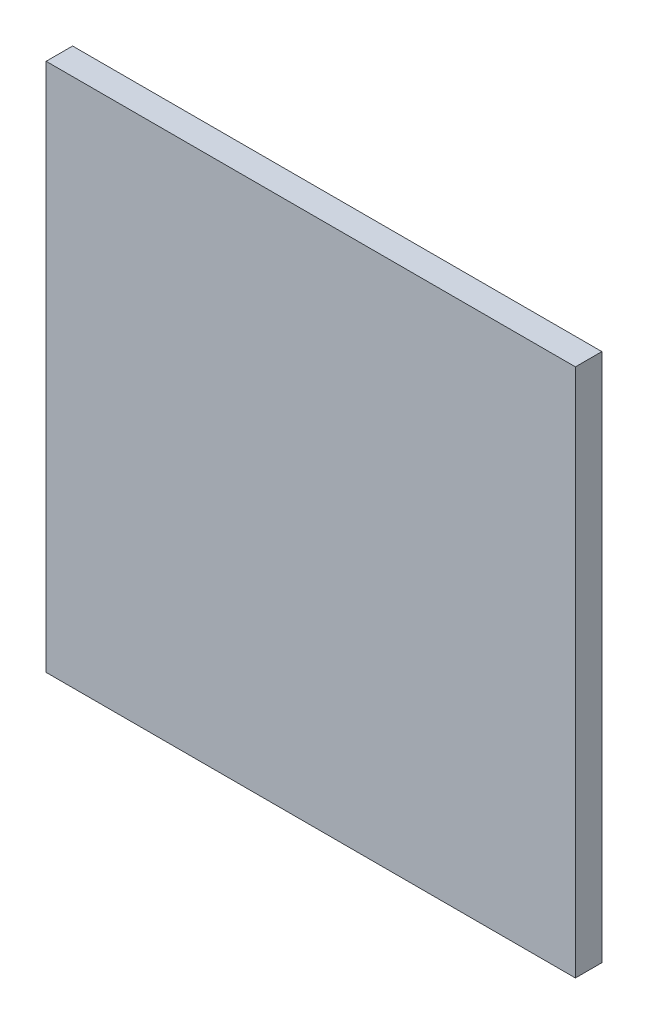
ISO-10303-21;
HEADER;
FILE_DESCRIPTION(('STEP AP214'),'2;1');
FILE_NAME('part.step','',(''),(''),'','','');
FILE_SCHEMA(('AUTOMOTIVE_DESIGN { 1 0 10303 214 1 1 1 1 }'));
ENDSEC;
DATA;
#1=APPLICATION_CONTEXT('core data for automotive mechanical design processes');
#2=APPLICATION_PROTOCOL_DEFINITION('international standard','automotive_design',2000,#1);
#3=PRODUCT_CONTEXT('',#1,'mechanical');
#4=PRODUCT('Part','Part','',(#3));
#5=PRODUCT_RELATED_PRODUCT_CATEGORY('part','',(#4));
#6=PRODUCT_DEFINITION_FORMATION('','',#4);
#7=PRODUCT_DEFINITION_CONTEXT('part definition',#1,'design');
#8=PRODUCT_DEFINITION('design','',#6,#7);
#9=PRODUCT_DEFINITION_SHAPE('','',#8);
#10=(LENGTH_UNIT() NAMED_UNIT(*) SI_UNIT(.MILLI.,.METRE.));
#11=(NAMED_UNIT(*) PLANE_ANGLE_UNIT() SI_UNIT($,.RADIAN.));
#12=(NAMED_UNIT(*) SI_UNIT($,.STERADIAN.) SOLID_ANGLE_UNIT());
#13=UNCERTAINTY_MEASURE_WITH_UNIT(LENGTH_MEASURE(1.E-05),#10,'distance_accuracy_value','');
#14=(GEOMETRIC_REPRESENTATION_CONTEXT(3) GLOBAL_UNCERTAINTY_ASSIGNED_CONTEXT((#13)) GLOBAL_UNIT_ASSIGNED_CONTEXT((#10,
#11,#12)) REPRESENTATION_CONTEXT('',''));
#15=CARTESIAN_POINT('',(0.,0.,0.));
#16=DIRECTION('',(0.,0.,1.));
#17=DIRECTION('',(1.,0.,0.));
#18=AXIS2_PLACEMENT_3D('',#15,#16,#17);
#19=CARTESIAN_POINT('',(0.,0.,0.));
#20=DIRECTION('',(0.,0.,1.));
#21=DIRECTION('',(1.,0.,0.));
#22=AXIS2_PLACEMENT_3D('',#19,#20,#21);
#23=PLANE('',#22);
#24=DIRECTION('',(1.,0.,0.));
#25=VECTOR('',#24,1.);
#26=CARTESIAN_POINT('',(7.,-7.,0.));
#27=LINE('',#26,#25);
#28=CARTESIAN_POINT('',(-7.,-7.,0.));
#29=VERTEX_POINT('',#28);
#30=CARTESIAN_POINT('',(7.,-7.,0.));
#31=VERTEX_POINT('',#30);
#32=EDGE_CURVE('E56',#29,#31,#27,.T.);
#33=ORIENTED_EDGE('',*,*,#32,.F.);
#34=DIRECTION('',(0.,1.,0.));
#35=VECTOR('',#34,1.);
#36=CARTESIAN_POINT('',(-7.,-7.,0.));
#37=LINE('',#36,#35);
#38=CARTESIAN_POINT('',(-7.,7.,0.));
#39=VERTEX_POINT('',#38);
#40=EDGE_CURVE('E19',#39,#29,#37,.F.);
#41=ORIENTED_EDGE('',*,*,#40,.F.);
#42=DIRECTION('',(1.,0.,0.));
#43=VECTOR('',#42,1.);
#44=CARTESIAN_POINT('',(-7.,7.,0.));
#45=LINE('',#44,#43);
#46=CARTESIAN_POINT('',(7.,7.,0.));
#47=VERTEX_POINT('',#46);
#48=EDGE_CURVE('E78',#47,#39,#45,.F.);
#49=ORIENTED_EDGE('',*,*,#48,.F.);
#50=DIRECTION('',(0.,1.,0.));
#51=VECTOR('',#50,1.);
#52=CARTESIAN_POINT('',(7.,7.,0.));
#53=LINE('',#52,#51);
#54=EDGE_CURVE('E54',#31,#47,#53,.T.);
#55=ORIENTED_EDGE('',*,*,#54,.F.);
#56=EDGE_LOOP('',(#33,#41,#49,#55));
#57=FACE_BOUND('',#56,.T.);
#58=ADVANCED_FACE('F16',(#57),#23,.F.);
#59=CARTESIAN_POINT('',(-7.,-7.,0.));
#60=DIRECTION('',(-1.,0.,0.));
#61=DIRECTION('',(0.,0.,1.));
#62=AXIS2_PLACEMENT_3D('',#59,#60,#61);
#63=PLANE('',#62);
#64=DIRECTION('',(0.,1.,0.));
#65=VECTOR('',#64,1.);
#66=CARTESIAN_POINT('',(-7.,0.,0.7));
#67=LINE('',#66,#65);
#68=CARTESIAN_POINT('',(-7.,7.,0.7));
#69=VERTEX_POINT('',#68);
#70=CARTESIAN_POINT('',(-7.,-7.,0.7));
#71=VERTEX_POINT('',#70);
#72=EDGE_CURVE('E82',#69,#71,#67,.F.);
#73=ORIENTED_EDGE('',*,*,#72,.F.);
#74=DIRECTION('',(0.,0.,1.));
#75=VECTOR('',#74,1.);
#76=CARTESIAN_POINT('',(-7.,7.,0.));
#77=LINE('',#76,#75);
#78=EDGE_CURVE('E67',#39,#69,#77,.T.);
#79=ORIENTED_EDGE('',*,*,#78,.F.);
#80=ORIENTED_EDGE('',*,*,#40,.T.);
#81=DIRECTION('',(0.,0.,-1.));
#82=VECTOR('',#81,1.);
#83=CARTESIAN_POINT('',(-7.,-7.,0.));
#84=LINE('',#83,#82);
#85=EDGE_CURVE('E62',#71,#29,#84,.T.);
#86=ORIENTED_EDGE('',*,*,#85,.F.);
#87=EDGE_LOOP('',(#73,#79,#80,#86));
#88=FACE_BOUND('',#87,.T.);
#89=ADVANCED_FACE('F64',(#88),#63,.T.);
#90=CARTESIAN_POINT('',(7.,-7.,0.));
#91=DIRECTION('',(0.,-1.,0.));
#92=DIRECTION('',(0.,0.,-1.));
#93=AXIS2_PLACEMENT_3D('',#90,#91,#92);
#94=PLANE('',#93);
#95=DIRECTION('',(1.,0.,0.));
#96=VECTOR('',#95,1.);
#97=CARTESIAN_POINT('',(0.,-7.,0.7));
#98=LINE('',#97,#96);
#99=CARTESIAN_POINT('',(7.,-7.,0.7));
#100=VERTEX_POINT('',#99);
#101=EDGE_CURVE('E71',#71,#100,#98,.T.);
#102=ORIENTED_EDGE('',*,*,#101,.F.);
#103=ORIENTED_EDGE('',*,*,#85,.T.);
#104=ORIENTED_EDGE('',*,*,#32,.T.);
#105=DIRECTION('',(0.,0.,-1.));
#106=VECTOR('',#105,1.);
#107=CARTESIAN_POINT('',(7.,-7.,0.));
#108=LINE('',#107,#106);
#109=EDGE_CURVE('E74',#100,#31,#108,.T.);
#110=ORIENTED_EDGE('',*,*,#109,.F.);
#111=EDGE_LOOP('',(#102,#103,#104,#110));
#112=FACE_BOUND('',#111,.T.);
#113=ADVANCED_FACE('F69',(#112),#94,.T.);
#114=CARTESIAN_POINT('',(7.,7.,0.));
#115=DIRECTION('',(1.,0.,0.));
#116=DIRECTION('',(0.,0.,-1.));
#117=AXIS2_PLACEMENT_3D('',#114,#115,#116);
#118=PLANE('',#117);
#119=DIRECTION('',(0.,1.,0.));
#120=VECTOR('',#119,1.);
#121=CARTESIAN_POINT('',(7.,0.,0.7));
#122=LINE('',#121,#120);
#123=CARTESIAN_POINT('',(7.,7.,0.7));
#124=VERTEX_POINT('',#123);
#125=EDGE_CURVE('E25',#100,#124,#122,.T.);
#126=ORIENTED_EDGE('',*,*,#125,.F.);
#127=ORIENTED_EDGE('',*,*,#109,.T.);
#128=ORIENTED_EDGE('',*,*,#54,.T.);
#129=DIRECTION('',(0.,0.,1.));
#130=VECTOR('',#129,1.);
#131=CARTESIAN_POINT('',(7.,7.,0.));
#132=LINE('',#131,#130);
#133=EDGE_CURVE('E34',#124,#47,#132,.F.);
#134=ORIENTED_EDGE('',*,*,#133,.F.);
#135=EDGE_LOOP('',(#126,#127,#128,#134));
#136=FACE_BOUND('',#135,.T.);
#137=ADVANCED_FACE('F88',(#136),#118,.T.);
#138=CARTESIAN_POINT('',(-7.,7.,0.));
#139=DIRECTION('',(0.,1.,0.));
#140=DIRECTION('',(0.,0.,1.));
#141=AXIS2_PLACEMENT_3D('',#138,#139,#140);
#142=PLANE('',#141);
#143=DIRECTION('',(1.,0.,0.));
#144=VECTOR('',#143,1.);
#145=CARTESIAN_POINT('',(0.,7.,0.7));
#146=LINE('',#145,#144);
#147=EDGE_CURVE('E11',#124,#69,#146,.F.);
#148=ORIENTED_EDGE('',*,*,#147,.F.);
#149=ORIENTED_EDGE('',*,*,#133,.T.);
#150=ORIENTED_EDGE('',*,*,#48,.T.);
#151=ORIENTED_EDGE('',*,*,#78,.T.);
#152=EDGE_LOOP('',(#148,#149,#150,#151));
#153=FACE_BOUND('',#152,.T.);
#154=ADVANCED_FACE('F90',(#153),#142,.T.);
#155=CARTESIAN_POINT('',(0.,0.,0.7));
#156=DIRECTION('',(0.,0.,1.));
#157=DIRECTION('',(1.,0.,0.));
#158=AXIS2_PLACEMENT_3D('',#155,#156,#157);
#159=PLANE('',#158);
#160=ORIENTED_EDGE('',*,*,#125,.T.);
#161=ORIENTED_EDGE('',*,*,#147,.T.);
#162=ORIENTED_EDGE('',*,*,#72,.T.);
#163=ORIENTED_EDGE('',*,*,#101,.T.);
#164=EDGE_LOOP('',(#160,#161,#162,#163));
#165=FACE_BOUND('',#164,.T.);
#166=ADVANCED_FACE('F87',(#165),#159,.T.);
#167=CLOSED_SHELL('',(#58,#89,#113,#137,#154,#166));
#168=MANIFOLD_SOLID_BREP('B1',#167);
#169=ADVANCED_BREP_SHAPE_REPRESENTATION('',(#18,#168),#14);
#170=SHAPE_DEFINITION_REPRESENTATION(#9,#169);
ENDSEC;
END-ISO-10303-21;
